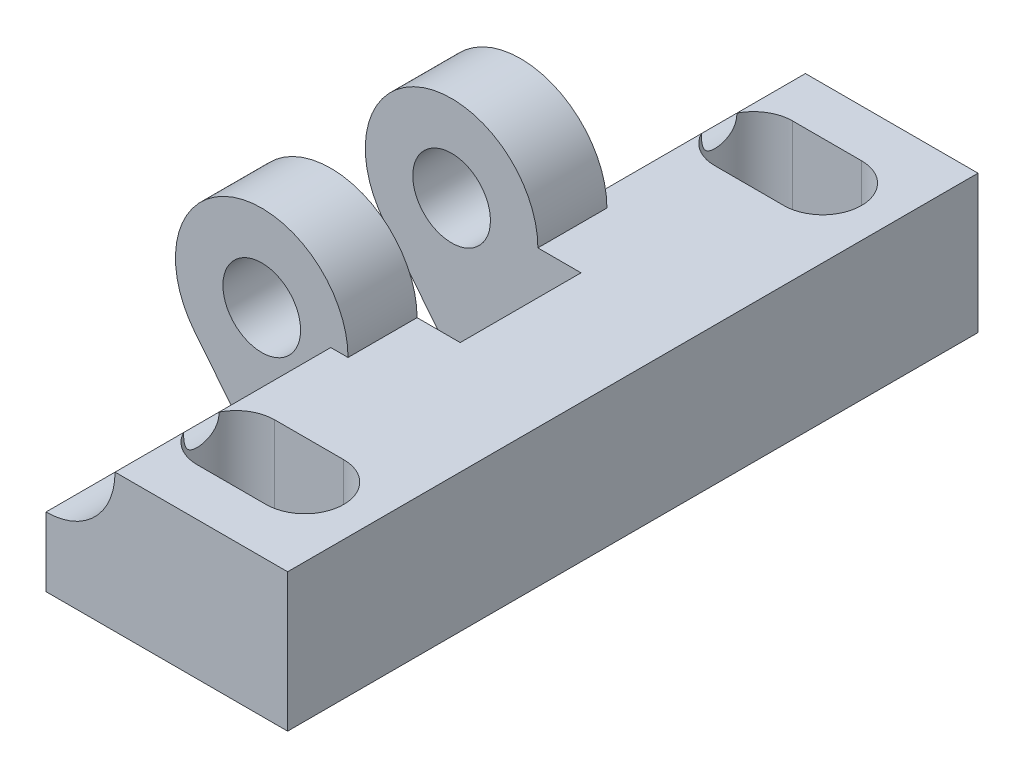
ISO-10303-21;
HEADER;
FILE_DESCRIPTION(('STEP AP214'),'2;1');
FILE_NAME('part.step','',(''),(''),'','','');
FILE_SCHEMA(('AUTOMOTIVE_DESIGN { 1 0 10303 214 1 1 1 1 }'));
ENDSEC;
DATA;
#1=APPLICATION_CONTEXT('core data for automotive mechanical design processes');
#2=APPLICATION_PROTOCOL_DEFINITION('international standard','automotive_design',2000,#1);
#3=PRODUCT_CONTEXT('',#1,'mechanical');
#4=PRODUCT('Part','Part','',(#3));
#5=PRODUCT_RELATED_PRODUCT_CATEGORY('part','',(#4));
#6=PRODUCT_DEFINITION_FORMATION('','',#4);
#7=PRODUCT_DEFINITION_CONTEXT('part definition',#1,'design');
#8=PRODUCT_DEFINITION('design','',#6,#7);
#9=PRODUCT_DEFINITION_SHAPE('','',#8);
#10=(LENGTH_UNIT() NAMED_UNIT(*) SI_UNIT(.MILLI.,.METRE.));
#11=(NAMED_UNIT(*) PLANE_ANGLE_UNIT() SI_UNIT($,.RADIAN.));
#12=(NAMED_UNIT(*) SI_UNIT($,.STERADIAN.) SOLID_ANGLE_UNIT());
#13=UNCERTAINTY_MEASURE_WITH_UNIT(LENGTH_MEASURE(1.E-05),#10,'distance_accuracy_value','');
#14=(GEOMETRIC_REPRESENTATION_CONTEXT(3) GLOBAL_UNCERTAINTY_ASSIGNED_CONTEXT((#13)) GLOBAL_UNIT_ASSIGNED_CONTEXT((#10,
#11,#12)) REPRESENTATION_CONTEXT('',''));
#15=CARTESIAN_POINT('',(0.,0.,0.));
#16=DIRECTION('',(0.,0.,1.));
#17=DIRECTION('',(1.,0.,0.));
#18=AXIS2_PLACEMENT_3D('',#15,#16,#17);
#19=CARTESIAN_POINT('',(-13.,8.,-20.));
#20=DIRECTION('',(0.,0.,1.));
#21=DIRECTION('',(1.,0.,0.));
#22=AXIS2_PLACEMENT_3D('',#19,#20,#21);
#23=CYLINDRICAL_SURFACE('',#22,2.25);
#24=CARTESIAN_POINT('',(-13.,8.,-3.5));
#25=DIRECTION('',(0.,0.,1.));
#26=DIRECTION('',(1.,0.,0.));
#27=AXIS2_PLACEMENT_3D('',#24,#25,#26);
#28=CIRCLE('',#27,2.25);
#29=CARTESIAN_POINT('',(-10.75,8.,-3.5));
#30=VERTEX_POINT('',#29);
#31=EDGE_CURVE('E341',#30,#30,#28,.T.);
#32=ORIENTED_EDGE('',*,*,#31,.T.);
#33=EDGE_LOOP('',(#32));
#34=FACE_BOUND('',#33,.T.);
#35=CARTESIAN_POINT('',(-13.,8.,-7.5));
#36=DIRECTION('',(0.,0.,1.));
#37=DIRECTION('',(1.,0.,0.));
#38=AXIS2_PLACEMENT_3D('',#35,#36,#37);
#39=CIRCLE('',#38,2.25);
#40=CARTESIAN_POINT('',(-10.75,8.,-7.5));
#41=VERTEX_POINT('',#40);
#42=EDGE_CURVE('E344',#41,#41,#39,.T.);
#43=ORIENTED_EDGE('',*,*,#42,.F.);
#44=EDGE_LOOP('',(#43));
#45=FACE_BOUND('',#44,.T.);
#46=ADVANCED_FACE('F34',(#34,#45),#23,.F.);
#47=CARTESIAN_POINT('',(0.,8.,0.));
#48=DIRECTION('',(0.,-1.,0.));
#49=DIRECTION('',(0.,0.,-1.));
#50=AXIS2_PLACEMENT_3D('',#47,#48,#49);
#51=PLANE('',#50);
#52=DIRECTION('',(1.,0.,0.));
#53=VECTOR('',#52,1.);
#54=CARTESIAN_POINT('',(1.00000000000001,8.,-20.));
#55=LINE('',#54,#53);
#56=CARTESIAN_POINT('',(-9.,8.,-20.));
#57=VERTEX_POINT('',#56);
#58=CARTESIAN_POINT('',(1.00000000000001,8.,-20.));
#59=VERTEX_POINT('',#58);
#60=EDGE_CURVE('E438',#57,#59,#55,.T.);
#61=ORIENTED_EDGE('',*,*,#60,.F.);
#62=DIRECTION('',(0.,0.,1.));
#63=VECTOR('',#62,1.);
#64=CARTESIAN_POINT('',(-9.,8.,-20.));
#65=LINE('',#64,#63);
#66=CARTESIAN_POINT('',(-9.,8.,-16.0307764064044));
#67=VERTEX_POINT('',#66);
#68=EDGE_CURVE('E226',#57,#67,#65,.T.);
#69=ORIENTED_EDGE('',*,*,#68,.T.);
#70=CARTESIAN_POINT('',(-6.99999999999999,8.,-15.));
#71=DIRECTION('',(0.,-1.,0.));
#72=DIRECTION('',(0.,0.,-1.));
#73=AXIS2_PLACEMENT_3D('',#70,#71,#72);
#74=CIRCLE('',#73,2.25);
#75=CARTESIAN_POINT('',(-6.99999999999999,8.,-17.25));
#76=VERTEX_POINT('',#75);
#77=EDGE_CURVE('E371',#67,#76,#74,.T.);
#78=ORIENTED_EDGE('',*,*,#77,.T.);
#79=DIRECTION('',(1.,0.,0.));
#80=VECTOR('',#79,1.);
#81=CARTESIAN_POINT('',(-6.99999999999999,8.,-17.25));
#82=LINE('',#81,#80);
#83=CARTESIAN_POINT('',(-2.99999999999999,8.,-17.25));
#84=VERTEX_POINT('',#83);
#85=EDGE_CURVE('E370',#76,#84,#82,.T.);
#86=ORIENTED_EDGE('',*,*,#85,.T.);
#87=CARTESIAN_POINT('',(-2.99999999999999,8.,-15.));
#88=DIRECTION('',(0.,-1.,0.));
#89=DIRECTION('',(0.,0.,-1.));
#90=AXIS2_PLACEMENT_3D('',#87,#88,#89);
#91=CIRCLE('',#90,2.25);
#92=CARTESIAN_POINT('',(-2.99999999999999,8.,-12.75));
#93=VERTEX_POINT('',#92);
#94=EDGE_CURVE('E374',#84,#93,#91,.T.);
#95=ORIENTED_EDGE('',*,*,#94,.T.);
#96=DIRECTION('',(-1.,0.,0.));
#97=VECTOR('',#96,1.);
#98=CARTESIAN_POINT('',(-6.99999999999999,8.,-12.75));
#99=LINE('',#98,#97);
#100=CARTESIAN_POINT('',(-6.99999999999999,8.,-12.75));
#101=VERTEX_POINT('',#100);
#102=EDGE_CURVE('E377',#93,#101,#99,.T.);
#103=ORIENTED_EDGE('',*,*,#102,.T.);
#104=CARTESIAN_POINT('',(-9.,8.,-13.9692235935956));
#105=VERTEX_POINT('',#104);
#106=EDGE_CURVE('E225',#101,#105,#74,.T.);
#107=ORIENTED_EDGE('',*,*,#106,.T.);
#108=CARTESIAN_POINT('',(-9.,8.,-7.5));
#109=VERTEX_POINT('',#108);
#110=EDGE_CURVE('E209',#105,#109,#65,.T.);
#111=ORIENTED_EDGE('',*,*,#110,.T.);
#112=DIRECTION('',(-1.,0.,0.));
#113=VECTOR('',#112,1.);
#114=CARTESIAN_POINT('',(0.,8.,-7.5));
#115=LINE('',#114,#113);
#116=CARTESIAN_POINT('',(-7.99999999999999,8.,-7.5));
#117=VERTEX_POINT('',#116);
#118=EDGE_CURVE('E222',#117,#109,#115,.T.);
#119=ORIENTED_EDGE('',*,*,#118,.F.);
#120=DIRECTION('',(0.,0.,-1.));
#121=VECTOR('',#120,1.);
#122=CARTESIAN_POINT('',(-8.,8.,16.4012194668567));
#123=LINE('',#122,#121);
#124=CARTESIAN_POINT('',(-8.,8.,-3.5));
#125=VERTEX_POINT('',#124);
#126=EDGE_CURVE('E62',#125,#117,#123,.T.);
#127=ORIENTED_EDGE('',*,*,#126,.F.);
#128=DIRECTION('',(-1.,0.,0.));
#129=VECTOR('',#128,1.);
#130=CARTESIAN_POINT('',(0.,8.,-3.5));
#131=LINE('',#130,#129);
#132=CARTESIAN_POINT('',(-5.5,8.,-3.5));
#133=VERTEX_POINT('',#132);
#134=EDGE_CURVE('E360',#133,#125,#131,.T.);
#135=ORIENTED_EDGE('',*,*,#134,.F.);
#136=DIRECTION('',(0.,0.,-1.));
#137=VECTOR('',#136,1.);
#138=CARTESIAN_POINT('',(-5.5,8.,24.7132034355964));
#139=LINE('',#138,#137);
#140=CARTESIAN_POINT('',(-5.5,8.,3.5));
#141=VERTEX_POINT('',#140);
#142=EDGE_CURVE('E364',#141,#133,#139,.T.);
#143=ORIENTED_EDGE('',*,*,#142,.F.);
#144=DIRECTION('',(-1.,0.,0.));
#145=VECTOR('',#144,1.);
#146=CARTESIAN_POINT('',(0.,8.,3.5));
#147=LINE('',#146,#145);
#148=CARTESIAN_POINT('',(-8.,8.,3.5));
#149=VERTEX_POINT('',#148);
#150=EDGE_CURVE('E366',#141,#149,#147,.T.);
#151=ORIENTED_EDGE('',*,*,#150,.T.);
#152=DIRECTION('',(0.,0.,1.));
#153=VECTOR('',#152,1.);
#154=CARTESIAN_POINT('',(-8.,8.,-16.4012194668567));
#155=LINE('',#154,#153);
#156=CARTESIAN_POINT('',(-7.99999999999999,8.,7.5));
#157=VERTEX_POINT('',#156);
#158=EDGE_CURVE('E274',#149,#157,#155,.T.);
#159=ORIENTED_EDGE('',*,*,#158,.T.);
#160=DIRECTION('',(1.,0.,0.));
#161=VECTOR('',#160,1.);
#162=CARTESIAN_POINT('',(0.,8.,7.5));
#163=LINE('',#162,#161);
#164=CARTESIAN_POINT('',(-9.,8.,7.5));
#165=VERTEX_POINT('',#164);
#166=EDGE_CURVE('E231',#165,#157,#163,.T.);
#167=ORIENTED_EDGE('',*,*,#166,.F.);
#168=DIRECTION('',(0.,0.,-1.));
#169=VECTOR('',#168,1.);
#170=CARTESIAN_POINT('',(-9.,8.,20.));
#171=LINE('',#170,#169);
#172=CARTESIAN_POINT('',(-9.,8.,13.9692235935956));
#173=VERTEX_POINT('',#172);
#174=EDGE_CURVE('E486',#173,#165,#171,.T.);
#175=ORIENTED_EDGE('',*,*,#174,.F.);
#176=CARTESIAN_POINT('',(-6.99999999999999,8.,15.));
#177=DIRECTION('',(0.,-1.,0.));
#178=DIRECTION('',(0.,0.,-1.));
#179=AXIS2_PLACEMENT_3D('',#176,#177,#178);
#180=CIRCLE('',#179,2.25);
#181=CARTESIAN_POINT('',(-6.99999999999999,8.,12.75));
#182=VERTEX_POINT('',#181);
#183=EDGE_CURVE('E403',#173,#182,#180,.T.);
#184=ORIENTED_EDGE('',*,*,#183,.T.);
#185=DIRECTION('',(1.,0.,0.));
#186=VECTOR('',#185,1.);
#187=CARTESIAN_POINT('',(-6.99999999999999,8.,12.75));
#188=LINE('',#187,#186);
#189=CARTESIAN_POINT('',(-2.99999999999999,8.,12.75));
#190=VERTEX_POINT('',#189);
#191=EDGE_CURVE('E402',#182,#190,#188,.T.);
#192=ORIENTED_EDGE('',*,*,#191,.T.);
#193=CARTESIAN_POINT('',(-2.99999999999999,8.,15.));
#194=DIRECTION('',(0.,-1.,0.));
#195=DIRECTION('',(0.,0.,-1.));
#196=AXIS2_PLACEMENT_3D('',#193,#194,#195);
#197=CIRCLE('',#196,2.25);
#198=CARTESIAN_POINT('',(-2.99999999999999,8.,17.25));
#199=VERTEX_POINT('',#198);
#200=EDGE_CURVE('E406',#190,#199,#197,.T.);
#201=ORIENTED_EDGE('',*,*,#200,.T.);
#202=DIRECTION('',(-1.,0.,0.));
#203=VECTOR('',#202,1.);
#204=CARTESIAN_POINT('',(-6.99999999999999,8.,17.25));
#205=LINE('',#204,#203);
#206=CARTESIAN_POINT('',(-6.99999999999999,8.,17.25));
#207=VERTEX_POINT('',#206);
#208=EDGE_CURVE('E409',#199,#207,#205,.T.);
#209=ORIENTED_EDGE('',*,*,#208,.T.);
#210=CARTESIAN_POINT('',(-9.,8.,16.0307764064044));
#211=VERTEX_POINT('',#210);
#212=EDGE_CURVE('E399',#207,#211,#180,.T.);
#213=ORIENTED_EDGE('',*,*,#212,.T.);
#214=CARTESIAN_POINT('',(-9.,8.,20.));
#215=VERTEX_POINT('',#214);
#216=EDGE_CURVE('E488',#215,#211,#171,.T.);
#217=ORIENTED_EDGE('',*,*,#216,.F.);
#218=DIRECTION('',(-1.,0.,0.));
#219=VECTOR('',#218,1.);
#220=CARTESIAN_POINT('',(1.,8.,20.));
#221=LINE('',#220,#219);
#222=CARTESIAN_POINT('',(1.,8.,20.));
#223=VERTEX_POINT('',#222);
#224=EDGE_CURVE('E434',#223,#215,#221,.T.);
#225=ORIENTED_EDGE('',*,*,#224,.F.);
#226=DIRECTION('',(0.,0.,1.));
#227=VECTOR('',#226,1.);
#228=CARTESIAN_POINT('',(1.,8.,20.));
#229=LINE('',#228,#227);
#230=EDGE_CURVE('E431',#59,#223,#229,.T.);
#231=ORIENTED_EDGE('',*,*,#230,.F.);
#232=EDGE_LOOP('',(#61,#69,#78,#86,#95,#103,#107,#111,#119,#127,#135,#143,#151,#159,#167,#175,
#184,#192,#201,#209,#213,#217,#225,#231));
#233=FACE_BOUND('',#232,.T.);
#234=ADVANCED_FACE('F221',(#233),#51,.F.);
#235=CARTESIAN_POINT('',(-13.,8.,20.));
#236=DIRECTION('',(-1.,0.,0.));
#237=DIRECTION('',(0.,0.,1.));
#238=AXIS2_PLACEMENT_3D('',#235,#236,#237);
#239=PLANE('',#238);
#240=DIRECTION('',(0.,-1.,0.));
#241=VECTOR('',#240,1.);
#242=CARTESIAN_POINT('',(-13.,8.,20.));
#243=LINE('',#242,#241);
#244=CARTESIAN_POINT('',(-13.,4.,20.));
#245=VERTEX_POINT('',#244);
#246=CARTESIAN_POINT('',(-13.,0.,20.));
#247=VERTEX_POINT('',#246);
#248=EDGE_CURVE('E456',#245,#247,#243,.T.);
#249=ORIENTED_EDGE('',*,*,#248,.F.);
#250=DIRECTION('',(0.,0.,-1.));
#251=VECTOR('',#250,1.);
#252=CARTESIAN_POINT('',(-13.,4.,20.));
#253=LINE('',#252,#251);
#254=CARTESIAN_POINT('',(-13.,4.,7.5));
#255=VERTEX_POINT('',#254);
#256=EDGE_CURVE('E350',#245,#255,#253,.T.);
#257=ORIENTED_EDGE('',*,*,#256,.T.);
#258=DIRECTION('',(0.,1.,0.));
#259=VECTOR('',#258,1.);
#260=CARTESIAN_POINT('',(-13.,8.,7.5));
#261=LINE('',#260,#259);
#262=CARTESIAN_POINT('',(-13.,0.,7.5));
#263=VERTEX_POINT('',#262);
#264=EDGE_CURVE('E235',#263,#255,#261,.T.);
#265=ORIENTED_EDGE('',*,*,#264,.F.);
#266=DIRECTION('',(0.,0.,-1.));
#267=VECTOR('',#266,1.);
#268=CARTESIAN_POINT('',(-13.,0.,20.));
#269=LINE('',#268,#267);
#270=EDGE_CURVE('E447',#247,#263,#269,.T.);
#271=ORIENTED_EDGE('',*,*,#270,.F.);
#272=EDGE_LOOP('',(#249,#257,#265,#271));
#273=FACE_BOUND('',#272,.T.);
#274=ADVANCED_FACE('F336',(#273),#239,.T.);
#275=CARTESIAN_POINT('',(1.,8.,20.));
#276=DIRECTION('',(0.,0.,1.));
#277=DIRECTION('',(1.,0.,0.));
#278=AXIS2_PLACEMENT_3D('',#275,#276,#277);
#279=PLANE('',#278);
#280=ORIENTED_EDGE('',*,*,#224,.T.);
#281=CARTESIAN_POINT('',(-13.,8.,20.));
#282=DIRECTION('',(0.,0.,1.));
#283=DIRECTION('',(1.,0.,0.));
#284=AXIS2_PLACEMENT_3D('',#281,#282,#283);
#285=CIRCLE('',#284,4.);
#286=EDGE_CURVE('E484',#245,#215,#285,.T.);
#287=ORIENTED_EDGE('',*,*,#286,.F.);
#288=ORIENTED_EDGE('',*,*,#248,.T.);
#289=DIRECTION('',(-1.,0.,0.));
#290=VECTOR('',#289,1.);
#291=CARTESIAN_POINT('',(1.,0.,20.));
#292=LINE('',#291,#290);
#293=CARTESIAN_POINT('',(1.,0.,20.));
#294=VERTEX_POINT('',#293);
#295=EDGE_CURVE('E443',#294,#247,#292,.T.);
#296=ORIENTED_EDGE('',*,*,#295,.F.);
#297=DIRECTION('',(0.,-1.,0.));
#298=VECTOR('',#297,1.);
#299=CARTESIAN_POINT('',(1.,8.,20.));
#300=LINE('',#299,#298);
#301=EDGE_CURVE('E440',#223,#294,#300,.T.);
#302=ORIENTED_EDGE('',*,*,#301,.F.);
#303=EDGE_LOOP('',(#280,#287,#288,#296,#302));
#304=FACE_BOUND('',#303,.T.);
#305=ADVANCED_FACE('F481',(#304),#279,.T.);
#306=CARTESIAN_POINT('',(-6.99999999999999,8.,15.));
#307=DIRECTION('',(0.,-1.,0.));
#308=DIRECTION('',(0.,0.,-1.));
#309=AXIS2_PLACEMENT_3D('',#306,#307,#308);
#310=CYLINDRICAL_SURFACE('',#309,2.25);
#311=CARTESIAN_POINT('',(-9.,8.,16.0307764064044));
#312=CARTESIAN_POINT('',(-8.99999828521619,7.95696835974157,16.0307693699854));
#313=CARTESIAN_POINT('',(-9.00069516711605,7.91395195373741,16.0294291357235));
#314=CARTESIAN_POINT('',(-9.00346394895788,7.8281167395181,16.0240337390661));
#315=CARTESIAN_POINT('',(-9.00553642083207,7.78529802095558,16.019977447403));
#316=CARTESIAN_POINT('',(-9.01383018137509,7.65671234657181,16.0035700244574));
#317=CARTESIAN_POINT('',(-9.02212727202333,7.57156045644463,15.9869784126964));
#318=CARTESIAN_POINT('',(-9.04361848097676,7.40491150941854,15.9416769443111));
#319=CARTESIAN_POINT('',(-9.05682599062112,7.32342513644505,15.9129339195714));
#320=CARTESIAN_POINT('',(-9.0868223911805,7.16735664452246,15.8421096937605));
#321=CARTESIAN_POINT('',(-9.10359682568192,7.09274834878198,15.8000820092892));
#322=CARTESIAN_POINT('',(-9.13286945764595,6.9764371616648,15.7173657019275));
#323=CARTESIAN_POINT('',(-9.14501079970111,6.93186182755358,15.6805820518269));
#324=CARTESIAN_POINT('',(-9.16887875636676,6.84919556924806,15.6001821405229));
#325=CARTESIAN_POINT('',(-9.1806058044962,6.8110976975838,15.5565732974404));
#326=CARTESIAN_POINT('',(-9.20063232409613,6.74871835247885,15.4704680155591));
#327=CARTESIAN_POINT('',(-9.20917948202958,6.72319921159565,15.428929317398));
#328=CARTESIAN_POINT('',(-9.22430215061611,6.67914804108436,15.3419407217394));
#329=CARTESIAN_POINT('',(-9.23087844771237,6.66061322370229,15.2964923936651));
#330=CARTESIAN_POINT('',(-9.24136773564625,6.63144982450444,15.2025207363224));
#331=CARTESIAN_POINT('',(-9.24526558977757,6.62086614616948,15.1539815973472));
#332=CARTESIAN_POINT('',(-9.24984903361177,6.60844883361623,15.0556479012443));
#333=CARTESIAN_POINT('',(-9.25053600551689,6.60661143434342,15.0058538935882));
#334=CARTESIAN_POINT('',(-9.24871093648431,6.61153585851024,14.9116874832385));
#335=CARTESIAN_POINT('',(-9.24650652064839,6.61747066994537,14.867263006286));
#336=CARTESIAN_POINT('',(-9.23965520482174,6.63621645765171,14.7800998243984));
#337=CARTESIAN_POINT('',(-9.23500841004541,6.64902713772024,14.7373610469309));
#338=CARTESIAN_POINT('',(-9.22365650594214,6.6810917582233,14.6541100167041));
#339=CARTESIAN_POINT('',(-9.21692816559021,6.70041865317706,14.6136293093203));
#340=CARTESIAN_POINT('',(-9.20202211284789,6.74464786041338,14.5361481081476));
#341=CARTESIAN_POINT('',(-9.19384372178583,6.76955278484111,14.4991492564489));
#342=CARTESIAN_POINT('',(-9.17337429640168,6.83446076953124,14.4156794347152));
#343=CARTESIAN_POINT('',(-9.16070245597251,6.87660295640532,14.37096089523));
#344=CARTESIAN_POINT('',(-9.13520437855625,6.96771883326303,14.2891941468593));
#345=CARTESIAN_POINT('',(-9.12237791200466,7.01670423885159,14.2521593686761));
#346=CARTESIAN_POINT('',(-9.09393642720168,7.13546234813255,14.1753213215882));
#347=CARTESIAN_POINT('',(-9.07866885489291,7.20700966924718,14.138137596941));
#348=CARTESIAN_POINT('',(-9.05150777299608,7.35567330219777,14.0753459571186));
#349=CARTESIAN_POINT('',(-9.03962238381318,7.43280246850212,14.0497658154537));
#350=CARTESIAN_POINT('',(-9.02014590028812,7.59112334925092,14.0090279786548));
#351=CARTESIAN_POINT('',(-9.01259957469472,7.67234832894714,13.9939786034158));
#352=CARTESIAN_POINT('',(-9.00504709860651,7.79499816694741,13.9790635257398));
#353=CARTESIAN_POINT('',(-9.00315752817949,7.83589195745758,13.9753680633915));
#354=CARTESIAN_POINT('',(-9.00063347295653,7.91785279600628,13.9704514132117));
#355=CARTESIAN_POINT('',(-8.99999855436256,7.95891977923989,13.9692293701876));
#356=CARTESIAN_POINT('',(-8.99999999999997,7.99999999999966,13.9692235935943));
#357=B_SPLINE_CURVE_WITH_KNOTS('',3,(#311,#312,#313,#314,#315,#316,#317,#318,#319,#320,#321,
#322,#323,#324,#325,#326,#327,#328,#329,#330,#331,#332,#333,#334,#335,#336,#337,#338,#339,#340,
#341,#342,#343,#344,#345,#346,#347,#348,#349,#350,#351,#352,#353,#354,#355,#356),.UNSPECIFIED.,
.F.,.F.,(4,2,2,2,2,2,2,2,2,2,2,2,2,2,2,2,2,2,2,2,2,2,4),(0.,0.129036887007431,0.258127457613687,
0.518522124011814,0.77963219192877,1.03970351605235,1.21624898541809,1.39260388793356,
1.54047778387555,1.68829259409458,1.83693602911217,1.9855154710563,2.11949923900638,
2.25347723558886,2.38900799281202,2.5246023511665,2.71178940910143,2.8993009511113,
3.14418078856992,3.38964369966421,3.63759574258701,3.76082862987411,3.88401890171763),.UNSPECIFIED.);
#358=EDGE_CURVE('E47',#211,#173,#357,.T.);
#359=ORIENTED_EDGE('',*,*,#358,.F.);
#360=ORIENTED_EDGE('',*,*,#212,.F.);
#361=DIRECTION('',(0.,-1.,0.));
#362=VECTOR('',#361,1.);
#363=CARTESIAN_POINT('',(-6.99999999999999,8.,17.25));
#364=LINE('',#363,#362);
#365=CARTESIAN_POINT('',(-6.99999999999999,0.,17.25));
#366=VERTEX_POINT('',#365);
#367=EDGE_CURVE('E422',#207,#366,#364,.T.);
#368=ORIENTED_EDGE('',*,*,#367,.T.);
#369=CARTESIAN_POINT('',(-6.99999999999999,0.,15.));
#370=DIRECTION('',(0.,-1.,0.));
#371=DIRECTION('',(0.,0.,-1.));
#372=AXIS2_PLACEMENT_3D('',#369,#370,#371);
#373=CIRCLE('',#372,2.25);
#374=CARTESIAN_POINT('',(-6.99999999999999,0.,12.75));
#375=VERTEX_POINT('',#374);
#376=EDGE_CURVE('E392',#366,#375,#373,.T.);
#377=ORIENTED_EDGE('',*,*,#376,.T.);
#378=DIRECTION('',(0.,-1.,0.));
#379=VECTOR('',#378,1.);
#380=CARTESIAN_POINT('',(-6.99999999999999,8.,12.75));
#381=LINE('',#380,#379);
#382=EDGE_CURVE('E412',#182,#375,#381,.T.);
#383=ORIENTED_EDGE('',*,*,#382,.F.);
#384=ORIENTED_EDGE('',*,*,#183,.F.);
#385=EDGE_LOOP('',(#359,#360,#368,#377,#383,#384));
#386=FACE_BOUND('',#385,.T.);
#387=ADVANCED_FACE('F282',(#386),#310,.F.);
#388=CARTESIAN_POINT('',(-13.,8.,3.5));
#389=DIRECTION('',(0.,0.,1.));
#390=DIRECTION('',(1.,0.,0.));
#391=AXIS2_PLACEMENT_3D('',#388,#389,#390);
#392=CIRCLE('',#391,2.25);
#393=CARTESIAN_POINT('',(-10.75,8.,3.5));
#394=VERTEX_POINT('',#393);
#395=EDGE_CURVE('E347',#394,#394,#392,.T.);
#396=ORIENTED_EDGE('',*,*,#395,.F.);
#397=EDGE_LOOP('',(#396));
#398=FACE_BOUND('',#397,.T.);
#399=CARTESIAN_POINT('',(-13.,8.,7.5));
#400=DIRECTION('',(0.,0.,-1.));
#401=DIRECTION('',(-1.,0.,0.));
#402=AXIS2_PLACEMENT_3D('',#399,#400,#401);
#403=CIRCLE('',#402,2.25);
#404=CARTESIAN_POINT('',(-15.25,8.,7.5));
#405=VERTEX_POINT('',#404);
#406=EDGE_CURVE('E345',#405,#405,#403,.T.);
#407=ORIENTED_EDGE('',*,*,#406,.F.);
#408=EDGE_LOOP('',(#407));
#409=FACE_BOUND('',#408,.T.);
#410=ADVANCED_FACE('F293',(#398,#409),#23,.F.);
#411=CARTESIAN_POINT('',(-13.,8.,-7.5));
#412=DIRECTION('',(1.,0.,0.));
#413=DIRECTION('',(0.,0.,-1.));
#414=AXIS2_PLACEMENT_3D('',#411,#412,#413);
#415=PLANE('',#414);
#416=DIRECTION('',(0.,0.,-1.));
#417=VECTOR('',#416,1.);
#418=CARTESIAN_POINT('',(-13.,0.500000000000001,24.7132034355964));
#419=LINE('',#418,#417);
#420=CARTESIAN_POINT('',(-13.,0.500000000000001,-3.5));
#421=VERTEX_POINT('',#420);
#422=CARTESIAN_POINT('',(-13.,0.500000000000001,3.5));
#423=VERTEX_POINT('',#422);
#424=EDGE_CURVE('E362',#421,#423,#419,.F.);
#425=ORIENTED_EDGE('',*,*,#424,.F.);
#426=DIRECTION('',(0.,1.,0.));
#427=VECTOR('',#426,1.);
#428=CARTESIAN_POINT('',(-13.,0.,-3.5));
#429=LINE('',#428,#427);
#430=CARTESIAN_POINT('',(-13.,0.,-3.5));
#431=VERTEX_POINT('',#430);
#432=EDGE_CURVE('E248',#431,#421,#429,.T.);
#433=ORIENTED_EDGE('',*,*,#432,.F.);
#434=DIRECTION('',(0.,0.,1.));
#435=VECTOR('',#434,1.);
#436=CARTESIAN_POINT('',(-13.,0.,-7.5));
#437=LINE('',#436,#435);
#438=CARTESIAN_POINT('',(-13.,0.,3.5));
#439=VERTEX_POINT('',#438);
#440=EDGE_CURVE('E270',#431,#439,#437,.T.);
#441=ORIENTED_EDGE('',*,*,#440,.T.);
#442=DIRECTION('',(0.,-1.,0.));
#443=VECTOR('',#442,1.);
#444=CARTESIAN_POINT('',(-13.,8.,3.5));
#445=LINE('',#444,#443);
#446=EDGE_CURVE('E268',#423,#439,#445,.T.);
#447=ORIENTED_EDGE('',*,*,#446,.F.);
#448=EDGE_LOOP('',(#425,#433,#441,#447));
#449=FACE_BOUND('',#448,.T.);
#450=ADVANCED_FACE('F296',(#449),#415,.F.);
#451=CARTESIAN_POINT('',(0.,8.,-7.5));
#452=DIRECTION('',(0.,0.,1.));
#453=DIRECTION('',(1.,0.,0.));
#454=AXIS2_PLACEMENT_3D('',#451,#452,#453);
#455=PLANE('',#454);
#456=ORIENTED_EDGE('',*,*,#118,.T.);
#457=CARTESIAN_POINT('',(-13.,8.,-7.5));
#458=DIRECTION('',(0.,0.,1.));
#459=DIRECTION('',(1.,0.,0.));
#460=AXIS2_PLACEMENT_3D('',#457,#458,#459);
#461=CIRCLE('',#460,4.);
#462=CARTESIAN_POINT('',(-13.,4.,-7.5));
#463=VERTEX_POINT('',#462);
#464=EDGE_CURVE('E206',#463,#109,#461,.T.);
#465=ORIENTED_EDGE('',*,*,#464,.F.);
#466=DIRECTION('',(0.,-1.,0.));
#467=VECTOR('',#466,1.);
#468=CARTESIAN_POINT('',(-13.,8.,-7.5));
#469=LINE('',#468,#467);
#470=CARTESIAN_POINT('',(-13.,0.,-7.5));
#471=VERTEX_POINT('',#470);
#472=EDGE_CURVE('E232',#463,#471,#469,.T.);
#473=ORIENTED_EDGE('',*,*,#472,.T.);
#474=DIRECTION('',(0.625,-0.7806247497998,0.));
#475=VECTOR('',#474,1.);
#476=CARTESIAN_POINT('',(-16.903123748999,4.875,-7.5));
#477=LINE('',#476,#475);
#478=CARTESIAN_POINT('',(-16.903123748999,4.875,-7.5));
#479=VERTEX_POINT('',#478);
#480=EDGE_CURVE('E241',#479,#471,#477,.T.);
#481=ORIENTED_EDGE('',*,*,#480,.F.);
#482=CARTESIAN_POINT('',(-13.,8.,-7.5));
#483=DIRECTION('',(0.,0.,1.));
#484=DIRECTION('',(1.,0.,0.));
#485=AXIS2_PLACEMENT_3D('',#482,#483,#484);
#486=CIRCLE('',#485,5.);
#487=EDGE_CURVE('E230',#117,#479,#486,.T.);
#488=ORIENTED_EDGE('',*,*,#487,.F.);
#489=EDGE_LOOP('',(#456,#465,#473,#481,#488));
#490=FACE_BOUND('',#489,.T.);
#491=ORIENTED_EDGE('',*,*,#42,.T.);
#492=EDGE_LOOP('',(#491));
#493=FACE_BOUND('',#492,.T.);
#494=ADVANCED_FACE('F36',(#490,#493),#455,.F.);
#495=CARTESIAN_POINT('',(0.,8.,7.5));
#496=DIRECTION('',(0.,0.,-1.));
#497=DIRECTION('',(-1.,0.,0.));
#498=AXIS2_PLACEMENT_3D('',#495,#496,#497);
#499=PLANE('',#498);
#500=CARTESIAN_POINT('',(-13.,8.,7.5));
#501=DIRECTION('',(0.,0.,1.));
#502=DIRECTION('',(1.,0.,0.));
#503=AXIS2_PLACEMENT_3D('',#500,#501,#502);
#504=CIRCLE('',#503,4.);
#505=EDGE_CURVE('E464',#255,#165,#504,.T.);
#506=ORIENTED_EDGE('',*,*,#505,.T.);
#507=ORIENTED_EDGE('',*,*,#166,.T.);
#508=CARTESIAN_POINT('',(-13.,8.,7.5));
#509=DIRECTION('',(0.,0.,1.));
#510=DIRECTION('',(1.,0.,0.));
#511=AXIS2_PLACEMENT_3D('',#508,#509,#510);
#512=CIRCLE('',#511,5.);
#513=CARTESIAN_POINT('',(-16.903123748999,4.875,7.5));
#514=VERTEX_POINT('',#513);
#515=EDGE_CURVE('E247',#157,#514,#512,.T.);
#516=ORIENTED_EDGE('',*,*,#515,.T.);
#517=DIRECTION('',(0.625,-0.7806247497998,0.));
#518=VECTOR('',#517,1.);
#519=CARTESIAN_POINT('',(-16.903123748999,4.875,7.5));
#520=LINE('',#519,#518);
#521=EDGE_CURVE('E259',#514,#263,#520,.T.);
#522=ORIENTED_EDGE('',*,*,#521,.T.);
#523=ORIENTED_EDGE('',*,*,#264,.T.);
#524=EDGE_LOOP('',(#506,#507,#516,#522,#523));
#525=FACE_BOUND('',#524,.T.);
#526=ORIENTED_EDGE('',*,*,#406,.T.);
#527=EDGE_LOOP('',(#526));
#528=FACE_BOUND('',#527,.T.);
#529=ADVANCED_FACE('F462',(#525,#528),#499,.F.);
#530=CARTESIAN_POINT('',(0.,0.,0.));
#531=DIRECTION('',(0.,-1.,0.));
#532=DIRECTION('',(0.,0.,-1.));
#533=AXIS2_PLACEMENT_3D('',#530,#531,#532);
#534=PLANE('',#533);
#535=EDGE_CURVE('E271',#471,#431,#437,.T.);
#536=ORIENTED_EDGE('',*,*,#535,.F.);
#537=CARTESIAN_POINT('',(-13.,0.,-20.));
#538=VERTEX_POINT('',#537);
#539=EDGE_CURVE('E446',#471,#538,#269,.T.);
#540=ORIENTED_EDGE('',*,*,#539,.T.);
#541=DIRECTION('',(1.,0.,0.));
#542=VECTOR('',#541,1.);
#543=CARTESIAN_POINT('',(1.00000000000001,0.,-20.));
#544=LINE('',#543,#542);
#545=CARTESIAN_POINT('',(1.00000000000001,0.,-20.));
#546=VERTEX_POINT('',#545);
#547=EDGE_CURVE('E435',#538,#546,#544,.T.);
#548=ORIENTED_EDGE('',*,*,#547,.T.);
#549=DIRECTION('',(0.,0.,1.));
#550=VECTOR('',#549,1.);
#551=CARTESIAN_POINT('',(1.,0.,20.));
#552=LINE('',#551,#550);
#553=EDGE_CURVE('E424',#546,#294,#552,.T.);
#554=ORIENTED_EDGE('',*,*,#553,.T.);
#555=ORIENTED_EDGE('',*,*,#295,.T.);
#556=ORIENTED_EDGE('',*,*,#270,.T.);
#557=DIRECTION('',(0.,0.,1.));
#558=VECTOR('',#557,1.);
#559=CARTESIAN_POINT('',(-13.,0.,-16.4012194668567));
#560=LINE('',#559,#558);
#561=EDGE_CURVE('E257',#439,#263,#560,.T.);
#562=ORIENTED_EDGE('',*,*,#561,.F.);
#563=ORIENTED_EDGE('',*,*,#440,.F.);
#564=EDGE_LOOP('',(#536,#540,#548,#554,#555,#556,#562,#563));
#565=FACE_BOUND('',#564,.T.);
#566=DIRECTION('',(1.,0.,0.));
#567=VECTOR('',#566,1.);
#568=CARTESIAN_POINT('',(-6.99999999999999,0.,12.75));
#569=LINE('',#568,#567);
#570=CARTESIAN_POINT('',(-2.99999999999999,0.,12.75));
#571=VERTEX_POINT('',#570);
#572=EDGE_CURVE('E414',#375,#571,#569,.T.);
#573=ORIENTED_EDGE('',*,*,#572,.F.);
#574=ORIENTED_EDGE('',*,*,#376,.F.);
#575=DIRECTION('',(-1.,0.,0.));
#576=VECTOR('',#575,1.);
#577=CARTESIAN_POINT('',(-6.99999999999999,0.,17.25));
#578=LINE('',#577,#576);
#579=CARTESIAN_POINT('',(-2.99999999999999,0.,17.25));
#580=VERTEX_POINT('',#579);
#581=EDGE_CURVE('E419',#580,#366,#578,.T.);
#582=ORIENTED_EDGE('',*,*,#581,.F.);
#583=CARTESIAN_POINT('',(-2.99999999999999,0.,15.));
#584=DIRECTION('',(0.,-1.,0.));
#585=DIRECTION('',(0.,0.,-1.));
#586=AXIS2_PLACEMENT_3D('',#583,#584,#585);
#587=CIRCLE('',#586,2.25);
#588=EDGE_CURVE('E416',#571,#580,#587,.T.);
#589=ORIENTED_EDGE('',*,*,#588,.F.);
#590=EDGE_LOOP('',(#573,#574,#582,#589));
#591=FACE_BOUND('',#590,.T.);
#592=DIRECTION('',(1.,0.,0.));
#593=VECTOR('',#592,1.);
#594=CARTESIAN_POINT('',(-6.99999999999999,0.,-17.25));
#595=LINE('',#594,#593);
#596=CARTESIAN_POINT('',(-6.99999999999999,0.,-17.25));
#597=VERTEX_POINT('',#596);
#598=CARTESIAN_POINT('',(-2.99999999999999,0.,-17.25));
#599=VERTEX_POINT('',#598);
#600=EDGE_CURVE('E381',#597,#599,#595,.T.);
#601=ORIENTED_EDGE('',*,*,#600,.F.);
#602=CARTESIAN_POINT('',(-6.99999999999999,0.,-15.));
#603=DIRECTION('',(0.,-1.,0.));
#604=DIRECTION('',(0.,0.,-1.));
#605=AXIS2_PLACEMENT_3D('',#602,#603,#604);
#606=CIRCLE('',#605,2.25);
#607=CARTESIAN_POINT('',(-6.99999999999999,0.,-12.75));
#608=VERTEX_POINT('',#607);
#609=EDGE_CURVE('E368',#608,#597,#606,.T.);
#610=ORIENTED_EDGE('',*,*,#609,.F.);
#611=DIRECTION('',(-1.,0.,0.));
#612=VECTOR('',#611,1.);
#613=CARTESIAN_POINT('',(-6.99999999999999,0.,-12.75));
#614=LINE('',#613,#612);
#615=CARTESIAN_POINT('',(-2.99999999999999,0.,-12.75));
#616=VERTEX_POINT('',#615);
#617=EDGE_CURVE('E387',#616,#608,#614,.T.);
#618=ORIENTED_EDGE('',*,*,#617,.F.);
#619=CARTESIAN_POINT('',(-2.99999999999999,0.,-15.));
#620=DIRECTION('',(0.,-1.,0.));
#621=DIRECTION('',(0.,0.,-1.));
#622=AXIS2_PLACEMENT_3D('',#619,#620,#621);
#623=CIRCLE('',#622,2.25);
#624=EDGE_CURVE('E384',#599,#616,#623,.T.);
#625=ORIENTED_EDGE('',*,*,#624,.F.);
#626=EDGE_LOOP('',(#601,#610,#618,#625));
#627=FACE_BOUND('',#626,.T.);
#628=ADVANCED_FACE('F474',(#565,#591,#627),#534,.T.);
#629=CARTESIAN_POINT('',(-13.,8.,-16.4012194668567));
#630=DIRECTION('',(0.,0.,1.));
#631=DIRECTION('',(1.,0.,0.));
#632=AXIS2_PLACEMENT_3D('',#629,#630,#631);
#633=CYLINDRICAL_SURFACE('',#632,5.);
#634=ORIENTED_EDGE('',*,*,#158,.F.);
#635=CARTESIAN_POINT('',(-13.,8.,3.5));
#636=DIRECTION('',(0.,0.,1.));
#637=DIRECTION('',(1.,0.,0.));
#638=AXIS2_PLACEMENT_3D('',#635,#636,#637);
#639=CIRCLE('',#638,5.);
#640=CARTESIAN_POINT('',(-16.903123748999,4.875,3.5));
#641=VERTEX_POINT('',#640);
#642=EDGE_CURVE('E256',#641,#149,#639,.F.);
#643=ORIENTED_EDGE('',*,*,#642,.F.);
#644=DIRECTION('',(0.,0.,1.));
#645=VECTOR('',#644,1.);
#646=CARTESIAN_POINT('',(-16.903123748999,4.875,-16.4012194668567));
#647=LINE('',#646,#645);
#648=EDGE_CURVE('E262',#641,#514,#647,.T.);
#649=ORIENTED_EDGE('',*,*,#648,.T.);
#650=ORIENTED_EDGE('',*,*,#515,.F.);
#651=EDGE_LOOP('',(#634,#643,#649,#650));
#652=FACE_BOUND('',#651,.T.);
#653=ADVANCED_FACE('F511',(#652),#633,.T.);
#654=CARTESIAN_POINT('',(0.,0.,3.5));
#655=DIRECTION('',(0.,0.,1.));
#656=DIRECTION('',(1.,0.,0.));
#657=AXIS2_PLACEMENT_3D('',#654,#655,#656);
#658=PLANE('',#657);
#659=ORIENTED_EDGE('',*,*,#395,.T.);
#660=EDGE_LOOP('',(#659));
#661=FACE_BOUND('',#660,.T.);
#662=ORIENTED_EDGE('',*,*,#642,.T.);
#663=ORIENTED_EDGE('',*,*,#150,.F.);
#664=CARTESIAN_POINT('',(-13.,8.,3.5));
#665=DIRECTION('',(0.,0.,1.));
#666=DIRECTION('',(1.,0.,0.));
#667=AXIS2_PLACEMENT_3D('',#664,#665,#666);
#668=CIRCLE('',#667,7.5);
#669=EDGE_CURVE('E54',#423,#141,#668,.T.);
#670=ORIENTED_EDGE('',*,*,#669,.F.);
#671=ORIENTED_EDGE('',*,*,#446,.T.);
#672=DIRECTION('',(-0.625,0.7806247497998,0.));
#673=VECTOR('',#672,1.);
#674=CARTESIAN_POINT('',(-16.903123748999,4.875,3.5));
#675=LINE('',#674,#673);
#676=EDGE_CURVE('E254',#439,#641,#675,.T.);
#677=ORIENTED_EDGE('',*,*,#676,.T.);
#678=EDGE_LOOP('',(#662,#663,#670,#671,#677));
#679=FACE_BOUND('',#678,.T.);
#680=ADVANCED_FACE('F514',(#661,#679),#658,.F.);
#681=CARTESIAN_POINT('',(-16.903123748999,4.875,-16.4012194668567));
#682=DIRECTION('',(-0.7806247497998,-0.625,0.));
#683=DIRECTION('',(0.625,-0.7806247497998,0.));
#684=AXIS2_PLACEMENT_3D('',#681,#682,#683);
#685=PLANE('',#684);
#686=ORIENTED_EDGE('',*,*,#676,.F.);
#687=ORIENTED_EDGE('',*,*,#561,.T.);
#688=ORIENTED_EDGE('',*,*,#521,.F.);
#689=ORIENTED_EDGE('',*,*,#648,.F.);
#690=EDGE_LOOP('',(#686,#687,#688,#689));
#691=FACE_BOUND('',#690,.T.);
#692=ADVANCED_FACE('F513',(#691),#685,.T.);
#693=CARTESIAN_POINT('',(-13.,8.,16.4012194668567));
#694=DIRECTION('',(0.,0.,-1.));
#695=DIRECTION('',(-1.,0.,0.));
#696=AXIS2_PLACEMENT_3D('',#693,#694,#695);
#697=CYLINDRICAL_SURFACE('',#696,5.);
#698=CARTESIAN_POINT('',(-13.,8.,-3.5));
#699=DIRECTION('',(0.,0.,1.));
#700=DIRECTION('',(1.,0.,0.));
#701=AXIS2_PLACEMENT_3D('',#698,#699,#700);
#702=CIRCLE('',#701,5.);
#703=CARTESIAN_POINT('',(-16.903123748999,4.875,-3.5));
#704=VERTEX_POINT('',#703);
#705=EDGE_CURVE('E245',#125,#704,#702,.T.);
#706=ORIENTED_EDGE('',*,*,#705,.F.);
#707=ORIENTED_EDGE('',*,*,#126,.T.);
#708=ORIENTED_EDGE('',*,*,#487,.T.);
#709=DIRECTION('',(0.,0.,-1.));
#710=VECTOR('',#709,1.);
#711=CARTESIAN_POINT('',(-16.903123748999,4.875,16.4012194668567));
#712=LINE('',#711,#710);
#713=EDGE_CURVE('E240',#704,#479,#712,.T.);
#714=ORIENTED_EDGE('',*,*,#713,.F.);
#715=EDGE_LOOP('',(#706,#707,#708,#714));
#716=FACE_BOUND('',#715,.T.);
#717=ADVANCED_FACE('F634',(#716),#697,.T.);
#718=CARTESIAN_POINT('',(0.,0.,-3.5));
#719=DIRECTION('',(0.,0.,1.));
#720=DIRECTION('',(1.,0.,0.));
#721=AXIS2_PLACEMENT_3D('',#718,#719,#720);
#722=PLANE('',#721);
#723=ORIENTED_EDGE('',*,*,#31,.F.);
#724=EDGE_LOOP('',(#723));
#725=FACE_BOUND('',#724,.T.);
#726=DIRECTION('',(0.625,-0.7806247497998,0.));
#727=VECTOR('',#726,1.);
#728=CARTESIAN_POINT('',(-16.903123748999,4.875,-3.5));
#729=LINE('',#728,#727);
#730=EDGE_CURVE('E244',#704,#431,#729,.T.);
#731=ORIENTED_EDGE('',*,*,#730,.T.);
#732=ORIENTED_EDGE('',*,*,#432,.T.);
#733=CARTESIAN_POINT('',(-13.,8.,-3.5));
#734=DIRECTION('',(0.,0.,1.));
#735=DIRECTION('',(1.,0.,0.));
#736=AXIS2_PLACEMENT_3D('',#733,#734,#735);
#737=CIRCLE('',#736,7.5);
#738=EDGE_CURVE('E356',#421,#133,#737,.T.);
#739=ORIENTED_EDGE('',*,*,#738,.T.);
#740=ORIENTED_EDGE('',*,*,#134,.T.);
#741=ORIENTED_EDGE('',*,*,#705,.T.);
#742=EDGE_LOOP('',(#731,#732,#739,#740,#741));
#743=FACE_BOUND('',#742,.T.);
#744=ADVANCED_FACE('F628',(#725,#743),#722,.T.);
#745=CARTESIAN_POINT('',(-16.903123748999,4.875,16.4012194668567));
#746=DIRECTION('',(0.7806247497998,0.625,0.));
#747=DIRECTION('',(-0.625,0.7806247497998,0.));
#748=AXIS2_PLACEMENT_3D('',#745,#746,#747);
#749=PLANE('',#748);
#750=ORIENTED_EDGE('',*,*,#730,.F.);
#751=ORIENTED_EDGE('',*,*,#713,.T.);
#752=ORIENTED_EDGE('',*,*,#480,.T.);
#753=ORIENTED_EDGE('',*,*,#535,.T.);
#754=EDGE_LOOP('',(#750,#751,#752,#753));
#755=FACE_BOUND('',#754,.T.);
#756=ADVANCED_FACE('F525',(#755),#749,.F.);
#757=DIRECTION('',(0.,0.,1.));
#758=VECTOR('',#757,1.);
#759=CARTESIAN_POINT('',(-13.,4.,-20.));
#760=LINE('',#759,#758);
#761=CARTESIAN_POINT('',(-13.,4.,-20.));
#762=VERTEX_POINT('',#761);
#763=EDGE_CURVE('E211',#762,#463,#760,.T.);
#764=ORIENTED_EDGE('',*,*,#763,.F.);
#765=DIRECTION('',(0.,-1.,0.));
#766=VECTOR('',#765,1.);
#767=CARTESIAN_POINT('',(-13.,8.,-20.));
#768=LINE('',#767,#766);
#769=EDGE_CURVE('E454',#762,#538,#768,.T.);
#770=ORIENTED_EDGE('',*,*,#769,.T.);
#771=ORIENTED_EDGE('',*,*,#539,.F.);
#772=ORIENTED_EDGE('',*,*,#472,.F.);
#773=EDGE_LOOP('',(#764,#770,#771,#772));
#774=FACE_BOUND('',#773,.T.);
#775=ADVANCED_FACE('F528',(#774),#239,.T.);
#776=CARTESIAN_POINT('',(1.,8.,20.));
#777=DIRECTION('',(1.,0.,0.));
#778=DIRECTION('',(0.,0.,-1.));
#779=AXIS2_PLACEMENT_3D('',#776,#777,#778);
#780=PLANE('',#779);
#781=ORIENTED_EDGE('',*,*,#553,.F.);
#782=DIRECTION('',(0.,-1.,0.));
#783=VECTOR('',#782,1.);
#784=CARTESIAN_POINT('',(1.00000000000001,8.,-20.));
#785=LINE('',#784,#783);
#786=EDGE_CURVE('E452',#59,#546,#785,.T.);
#787=ORIENTED_EDGE('',*,*,#786,.F.);
#788=ORIENTED_EDGE('',*,*,#230,.T.);
#789=ORIENTED_EDGE('',*,*,#301,.T.);
#790=EDGE_LOOP('',(#781,#787,#788,#789));
#791=FACE_BOUND('',#790,.T.);
#792=ADVANCED_FACE('F535',(#791),#780,.T.);
#793=CARTESIAN_POINT('',(1.00000000000001,8.,-20.));
#794=DIRECTION('',(0.,0.,-1.));
#795=DIRECTION('',(-1.,0.,0.));
#796=AXIS2_PLACEMENT_3D('',#793,#794,#795);
#797=PLANE('',#796);
#798=CARTESIAN_POINT('',(-13.,8.,-20.));
#799=DIRECTION('',(0.,0.,1.));
#800=DIRECTION('',(1.,0.,0.));
#801=AXIS2_PLACEMENT_3D('',#798,#799,#800);
#802=CIRCLE('',#801,4.);
#803=EDGE_CURVE('E215',#762,#57,#802,.T.);
#804=ORIENTED_EDGE('',*,*,#803,.T.);
#805=ORIENTED_EDGE('',*,*,#60,.T.);
#806=ORIENTED_EDGE('',*,*,#786,.T.);
#807=ORIENTED_EDGE('',*,*,#547,.F.);
#808=ORIENTED_EDGE('',*,*,#769,.F.);
#809=EDGE_LOOP('',(#804,#805,#806,#807,#808));
#810=FACE_BOUND('',#809,.T.);
#811=ADVANCED_FACE('F322',(#810),#797,.T.);
#812=CARTESIAN_POINT('',(-6.99999999999999,8.,17.25));
#813=DIRECTION('',(0.,0.,1.));
#814=DIRECTION('',(1.,0.,0.));
#815=AXIS2_PLACEMENT_3D('',#812,#813,#814);
#816=PLANE('',#815);
#817=ORIENTED_EDGE('',*,*,#581,.T.);
#818=ORIENTED_EDGE('',*,*,#367,.F.);
#819=ORIENTED_EDGE('',*,*,#208,.F.);
#820=DIRECTION('',(0.,-1.,0.));
#821=VECTOR('',#820,1.);
#822=CARTESIAN_POINT('',(-2.99999999999999,8.,17.25));
#823=LINE('',#822,#821);
#824=EDGE_CURVE('E425',#199,#580,#823,.T.);
#825=ORIENTED_EDGE('',*,*,#824,.T.);
#826=EDGE_LOOP('',(#817,#818,#819,#825));
#827=FACE_BOUND('',#826,.T.);
#828=ADVANCED_FACE('F318',(#827),#816,.F.);
#829=CARTESIAN_POINT('',(-2.99999999999999,8.,15.));
#830=DIRECTION('',(0.,-1.,0.));
#831=DIRECTION('',(0.,0.,-1.));
#832=AXIS2_PLACEMENT_3D('',#829,#830,#831);
#833=CYLINDRICAL_SURFACE('',#832,2.25);
#834=ORIENTED_EDGE('',*,*,#588,.T.);
#835=ORIENTED_EDGE('',*,*,#824,.F.);
#836=ORIENTED_EDGE('',*,*,#200,.F.);
#837=DIRECTION('',(0.,-1.,0.));
#838=VECTOR('',#837,1.);
#839=CARTESIAN_POINT('',(-2.99999999999999,8.,12.75));
#840=LINE('',#839,#838);
#841=EDGE_CURVE('E427',#190,#571,#840,.T.);
#842=ORIENTED_EDGE('',*,*,#841,.T.);
#843=EDGE_LOOP('',(#834,#835,#836,#842));
#844=FACE_BOUND('',#843,.T.);
#845=ADVANCED_FACE('F321',(#844),#833,.F.);
#846=CARTESIAN_POINT('',(-6.99999999999999,8.,12.75));
#847=DIRECTION('',(0.,0.,-1.));
#848=DIRECTION('',(-1.,0.,0.));
#849=AXIS2_PLACEMENT_3D('',#846,#847,#848);
#850=PLANE('',#849);
#851=ORIENTED_EDGE('',*,*,#572,.T.);
#852=ORIENTED_EDGE('',*,*,#841,.F.);
#853=ORIENTED_EDGE('',*,*,#191,.F.);
#854=ORIENTED_EDGE('',*,*,#382,.T.);
#855=EDGE_LOOP('',(#851,#852,#853,#854));
#856=FACE_BOUND('',#855,.T.);
#857=ADVANCED_FACE('F316',(#856),#850,.F.);
#858=CARTESIAN_POINT('',(-6.99999999999999,8.,-15.));
#859=DIRECTION('',(0.,-1.,0.));
#860=DIRECTION('',(0.,0.,-1.));
#861=AXIS2_PLACEMENT_3D('',#858,#859,#860);
#862=CYLINDRICAL_SURFACE('',#861,2.25);
#863=ORIENTED_EDGE('',*,*,#77,.F.);
#864=CARTESIAN_POINT('',(-9.,8.,-16.0307764064044));
#865=CARTESIAN_POINT('',(-8.99999828521619,7.95696835974157,-16.0307693699854));
#866=CARTESIAN_POINT('',(-9.00069516711605,7.91395195373741,-16.0294291357235));
#867=CARTESIAN_POINT('',(-9.00346394895788,7.8281167395181,-16.0240337390661));
#868=CARTESIAN_POINT('',(-9.00553642083207,7.78529802095558,-16.019977447403));
#869=CARTESIAN_POINT('',(-9.01383018137509,7.65671234657181,-16.0035700244574));
#870=CARTESIAN_POINT('',(-9.02212727202333,7.57156045644463,-15.9869784126964));
#871=CARTESIAN_POINT('',(-9.04361848097676,7.40491150941854,-15.9416769443111));
#872=CARTESIAN_POINT('',(-9.05682599062112,7.32342513644505,-15.9129339195714));
#873=CARTESIAN_POINT('',(-9.0868223911805,7.16735664452246,-15.8421096937605));
#874=CARTESIAN_POINT('',(-9.10359682568192,7.09274834878198,-15.8000820092892));
#875=CARTESIAN_POINT('',(-9.13286945764595,6.9764371616648,-15.7173657019275));
#876=CARTESIAN_POINT('',(-9.14501079970111,6.93186182755358,-15.6805820518269));
#877=CARTESIAN_POINT('',(-9.16887875636676,6.84919556924806,-15.6001821405229));
#878=CARTESIAN_POINT('',(-9.1806058044962,6.8110976975838,-15.5565732974404));
#879=CARTESIAN_POINT('',(-9.20063232409613,6.74871835247885,-15.4704680155591));
#880=CARTESIAN_POINT('',(-9.20917948202958,6.72319921159565,-15.428929317398));
#881=CARTESIAN_POINT('',(-9.22430215061611,6.67914804108436,-15.3419407217394));
#882=CARTESIAN_POINT('',(-9.23087844771237,6.66061322370229,-15.2964923936651));
#883=CARTESIAN_POINT('',(-9.24136773564625,6.63144982450444,-15.2025207363224));
#884=CARTESIAN_POINT('',(-9.24526558977757,6.62086614616948,-15.1539815973472));
#885=CARTESIAN_POINT('',(-9.24984903361177,6.60844883361623,-15.0556479012443));
#886=CARTESIAN_POINT('',(-9.25053600551689,6.60661143434342,-15.0058538935882));
#887=CARTESIAN_POINT('',(-9.24871093648431,6.61153585851024,-14.9116874832385));
#888=CARTESIAN_POINT('',(-9.24650652064839,6.61747066994537,-14.867263006286));
#889=CARTESIAN_POINT('',(-9.23965520482174,6.63621645765171,-14.7800998243984));
#890=CARTESIAN_POINT('',(-9.23500841004541,6.64902713772024,-14.7373610469309));
#891=CARTESIAN_POINT('',(-9.22365650594214,6.6810917582233,-14.6541100167041));
#892=CARTESIAN_POINT('',(-9.21692816559021,6.70041865317706,-14.6136293093203));
#893=CARTESIAN_POINT('',(-9.20202211284789,6.74464786041338,-14.5361481081476));
#894=CARTESIAN_POINT('',(-9.19384372178583,6.76955278484111,-14.4991492564489));
#895=CARTESIAN_POINT('',(-9.17337429640168,6.83446076953124,-14.4156794347152));
#896=CARTESIAN_POINT('',(-9.16070245597251,6.87660295640532,-14.37096089523));
#897=CARTESIAN_POINT('',(-9.13520437855625,6.96771883326303,-14.2891941468593));
#898=CARTESIAN_POINT('',(-9.12237791200466,7.01670423885159,-14.2521593686761));
#899=CARTESIAN_POINT('',(-9.09393642720168,7.13546234813255,-14.1753213215882));
#900=CARTESIAN_POINT('',(-9.07866885489291,7.20700966924718,-14.138137596941));
#901=CARTESIAN_POINT('',(-9.05150777299608,7.35567330219777,-14.0753459571186));
#902=CARTESIAN_POINT('',(-9.03962238381318,7.43280246850212,-14.0497658154537));
#903=CARTESIAN_POINT('',(-9.02014590028812,7.59112334925092,-14.0090279786548));
#904=CARTESIAN_POINT('',(-9.01259957469472,7.67234832894714,-13.9939786034158));
#905=CARTESIAN_POINT('',(-9.00504709860651,7.79499816694741,-13.9790635257398));
#906=CARTESIAN_POINT('',(-9.00315752817949,7.83589195745758,-13.9753680633915));
#907=CARTESIAN_POINT('',(-9.00063347295653,7.91785279600628,-13.9704514132117));
#908=CARTESIAN_POINT('',(-8.99999855436256,7.95891977923989,-13.9692293701876));
#909=CARTESIAN_POINT('',(-8.99999999999997,7.99999999999966,-13.9692235935943));
#910=B_SPLINE_CURVE_WITH_KNOTS('',3,(#864,#865,#866,#867,#868,#869,#870,#871,#872,#873,#874,
#875,#876,#877,#878,#879,#880,#881,#882,#883,#884,#885,#886,#887,#888,#889,#890,#891,#892,#893,
#894,#895,#896,#897,#898,#899,#900,#901,#902,#903,#904,#905,#906,#907,#908,#909),.UNSPECIFIED.,
.F.,.F.,(4,2,2,2,2,2,2,2,2,2,2,2,2,2,2,2,2,2,2,2,2,2,4),(0.,0.129036887007431,0.258127457613687,
0.518522124011814,0.77963219192877,1.03970351605235,1.21624898541809,1.39260388793356,
1.54047778387555,1.68829259409458,1.83693602911217,1.9855154710563,2.11949923900638,
2.25347723558886,2.38900799281202,2.5246023511665,2.71178940910143,2.8993009511113,
3.14418078856992,3.38964369966421,3.63759574258701,3.76082862987411,3.88401890171763),.UNSPECIFIED.);
#911=EDGE_CURVE('E12',#67,#105,#910,.T.);
#912=ORIENTED_EDGE('',*,*,#911,.T.);
#913=ORIENTED_EDGE('',*,*,#106,.F.);
#914=DIRECTION('',(0.,-1.,0.));
#915=VECTOR('',#914,1.);
#916=CARTESIAN_POINT('',(-6.99999999999999,8.,-12.75));
#917=LINE('',#916,#915);
#918=EDGE_CURVE('E390',#101,#608,#917,.T.);
#919=ORIENTED_EDGE('',*,*,#918,.T.);
#920=ORIENTED_EDGE('',*,*,#609,.T.);
#921=DIRECTION('',(0.,-1.,0.));
#922=VECTOR('',#921,1.);
#923=CARTESIAN_POINT('',(-6.99999999999999,8.,-17.25));
#924=LINE('',#923,#922);
#925=EDGE_CURVE('E379',#76,#597,#924,.T.);
#926=ORIENTED_EDGE('',*,*,#925,.F.);
#927=EDGE_LOOP('',(#863,#912,#913,#919,#920,#926));
#928=FACE_BOUND('',#927,.T.);
#929=ADVANCED_FACE('F306',(#928),#862,.F.);
#930=CARTESIAN_POINT('',(-6.99999999999999,8.,-12.75));
#931=DIRECTION('',(0.,0.,1.));
#932=DIRECTION('',(1.,0.,0.));
#933=AXIS2_PLACEMENT_3D('',#930,#931,#932);
#934=PLANE('',#933);
#935=ORIENTED_EDGE('',*,*,#617,.T.);
#936=ORIENTED_EDGE('',*,*,#918,.F.);
#937=ORIENTED_EDGE('',*,*,#102,.F.);
#938=DIRECTION('',(0.,-1.,0.));
#939=VECTOR('',#938,1.);
#940=CARTESIAN_POINT('',(-2.99999999999999,8.,-12.75));
#941=LINE('',#940,#939);
#942=EDGE_CURVE('E393',#93,#616,#941,.T.);
#943=ORIENTED_EDGE('',*,*,#942,.T.);
#944=EDGE_LOOP('',(#935,#936,#937,#943));
#945=FACE_BOUND('',#944,.T.);
#946=ADVANCED_FACE('F302',(#945),#934,.F.);
#947=CARTESIAN_POINT('',(-2.99999999999999,8.,-15.));
#948=DIRECTION('',(0.,-1.,0.));
#949=DIRECTION('',(0.,0.,-1.));
#950=AXIS2_PLACEMENT_3D('',#947,#948,#949);
#951=CYLINDRICAL_SURFACE('',#950,2.25);
#952=ORIENTED_EDGE('',*,*,#624,.T.);
#953=ORIENTED_EDGE('',*,*,#942,.F.);
#954=ORIENTED_EDGE('',*,*,#94,.F.);
#955=DIRECTION('',(0.,-1.,0.));
#956=VECTOR('',#955,1.);
#957=CARTESIAN_POINT('',(-2.99999999999999,8.,-17.25));
#958=LINE('',#957,#956);
#959=EDGE_CURVE('E395',#84,#599,#958,.T.);
#960=ORIENTED_EDGE('',*,*,#959,.T.);
#961=EDGE_LOOP('',(#952,#953,#954,#960));
#962=FACE_BOUND('',#961,.T.);
#963=ADVANCED_FACE('F305',(#962),#951,.F.);
#964=CARTESIAN_POINT('',(-6.99999999999999,8.,-17.25));
#965=DIRECTION('',(0.,0.,-1.));
#966=DIRECTION('',(-1.,0.,0.));
#967=AXIS2_PLACEMENT_3D('',#964,#965,#966);
#968=PLANE('',#967);
#969=ORIENTED_EDGE('',*,*,#600,.T.);
#970=ORIENTED_EDGE('',*,*,#959,.F.);
#971=ORIENTED_EDGE('',*,*,#85,.F.);
#972=ORIENTED_EDGE('',*,*,#925,.T.);
#973=EDGE_LOOP('',(#969,#970,#971,#972));
#974=FACE_BOUND('',#973,.T.);
#975=ADVANCED_FACE('F300',(#974),#968,.F.);
#976=CARTESIAN_POINT('',(-13.,8.,24.7132034355964));
#977=DIRECTION('',(0.,0.,-1.));
#978=DIRECTION('',(-1.,0.,0.));
#979=AXIS2_PLACEMENT_3D('',#976,#977,#978);
#980=CYLINDRICAL_SURFACE('',#979,7.5);
#981=ORIENTED_EDGE('',*,*,#142,.T.);
#982=ORIENTED_EDGE('',*,*,#738,.F.);
#983=ORIENTED_EDGE('',*,*,#424,.T.);
#984=ORIENTED_EDGE('',*,*,#669,.T.);
#985=EDGE_LOOP('',(#981,#982,#983,#984));
#986=FACE_BOUND('',#985,.T.);
#987=ADVANCED_FACE('F290',(#986),#980,.F.);
#988=CARTESIAN_POINT('',(-13.,8.,20.));
#989=DIRECTION('',(0.,0.,-1.));
#990=DIRECTION('',(-1.,0.,0.));
#991=AXIS2_PLACEMENT_3D('',#988,#989,#990);
#992=CYLINDRICAL_SURFACE('',#991,4.);
#993=ORIENTED_EDGE('',*,*,#286,.T.);
#994=ORIENTED_EDGE('',*,*,#216,.T.);
#995=ORIENTED_EDGE('',*,*,#358,.T.);
#996=ORIENTED_EDGE('',*,*,#174,.T.);
#997=ORIENTED_EDGE('',*,*,#505,.F.);
#998=ORIENTED_EDGE('',*,*,#256,.F.);
#999=EDGE_LOOP('',(#993,#994,#995,#996,#997,#998));
#1000=FACE_BOUND('',#999,.T.);
#1001=ADVANCED_FACE('F286',(#1000),#992,.F.);
#1002=CARTESIAN_POINT('',(-13.,8.,-20.));
#1003=DIRECTION('',(0.,0.,1.));
#1004=DIRECTION('',(1.,0.,0.));
#1005=AXIS2_PLACEMENT_3D('',#1002,#1003,#1004);
#1006=CYLINDRICAL_SURFACE('',#1005,4.);
#1007=ORIENTED_EDGE('',*,*,#763,.T.);
#1008=ORIENTED_EDGE('',*,*,#464,.T.);
#1009=ORIENTED_EDGE('',*,*,#110,.F.);
#1010=ORIENTED_EDGE('',*,*,#911,.F.);
#1011=ORIENTED_EDGE('',*,*,#68,.F.);
#1012=ORIENTED_EDGE('',*,*,#803,.F.);
#1013=EDGE_LOOP('',(#1007,#1008,#1009,#1010,#1011,#1012));
#1014=FACE_BOUND('',#1013,.T.);
#1015=ADVANCED_FACE('F208',(#1014),#1006,.F.);
#1016=CLOSED_SHELL('',(#46,#234,#274,#305,#387,#410,#450,#494,#529,#628,#653,#680,#692,#717,
#744,#756,#775,#792,#811,#828,#845,#857,#929,#946,#963,#975,#987,#1001,#1015));
#1017=MANIFOLD_SOLID_BREP('B2',#1016);
#1018=ADVANCED_BREP_SHAPE_REPRESENTATION('',(#18,#1017),#14);
#1019=SHAPE_DEFINITION_REPRESENTATION(#9,#1018);
ENDSEC;
END-ISO-10303-21;
